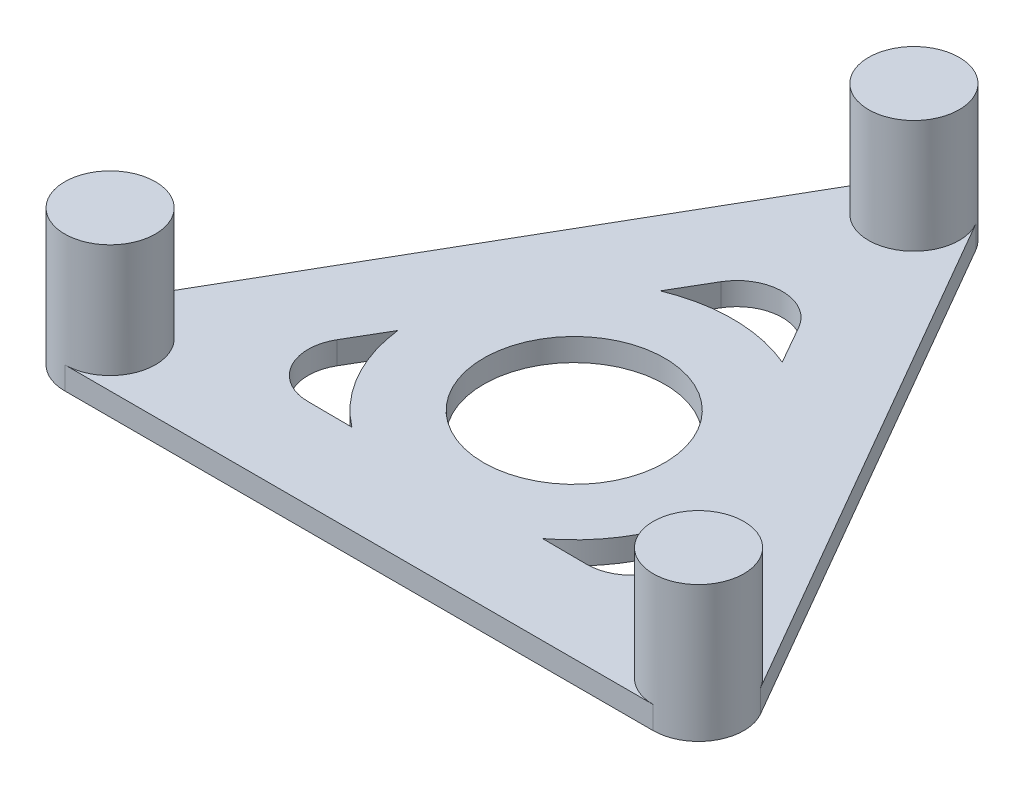
ISO-10303-21;
HEADER;
FILE_DESCRIPTION(('STEP AP214'),'2;1');
FILE_NAME('part.step','',(''),(''),'','','');
FILE_SCHEMA(('AUTOMOTIVE_DESIGN { 1 0 10303 214 1 1 1 1 }'));
ENDSEC;
DATA;
#1=APPLICATION_CONTEXT('core data for automotive mechanical design processes');
#2=APPLICATION_PROTOCOL_DEFINITION('international standard','automotive_design',2000,#1);
#3=PRODUCT_CONTEXT('',#1,'mechanical');
#4=PRODUCT('Part','Part','',(#3));
#5=PRODUCT_RELATED_PRODUCT_CATEGORY('part','',(#4));
#6=PRODUCT_DEFINITION_FORMATION('','',#4);
#7=PRODUCT_DEFINITION_CONTEXT('part definition',#1,'design');
#8=PRODUCT_DEFINITION('design','',#6,#7);
#9=PRODUCT_DEFINITION_SHAPE('','',#8);
#10=(LENGTH_UNIT() NAMED_UNIT(*) SI_UNIT(.MILLI.,.METRE.));
#11=(NAMED_UNIT(*) PLANE_ANGLE_UNIT() SI_UNIT($,.RADIAN.));
#12=(NAMED_UNIT(*) SI_UNIT($,.STERADIAN.) SOLID_ANGLE_UNIT());
#13=UNCERTAINTY_MEASURE_WITH_UNIT(LENGTH_MEASURE(1.E-05),#10,'distance_accuracy_value','');
#14=(GEOMETRIC_REPRESENTATION_CONTEXT(3) GLOBAL_UNCERTAINTY_ASSIGNED_CONTEXT((#13)) GLOBAL_UNIT_ASSIGNED_CONTEXT((#10,
#11,#12)) REPRESENTATION_CONTEXT('',''));
#15=CARTESIAN_POINT('',(0.,0.,0.));
#16=DIRECTION('',(0.,0.,1.));
#17=DIRECTION('',(1.,0.,0.));
#18=AXIS2_PLACEMENT_3D('',#15,#16,#17);
#19=CARTESIAN_POINT('',(-0.0324301599771953,1.,5.57369827589724));
#20=DIRECTION('',(-0.00581832913066579,0.,0.999983073379808));
#21=DIRECTION('',(0.999983073379808,0.,0.00581832913066579));
#22=AXIS2_PLACEMENT_3D('',#19,#20,#21);
#23=PLANE('',#22);
#24=DIRECTION('',(-0.999983073379808,0.,-0.00581832913066579));
#25=VECTOR('',#24,1.);
#26=CARTESIAN_POINT('',(-0.0324301599771953,0.,5.57369827589724));
#27=LINE('',#26,#25);
#28=CARTESIAN_POINT('',(6.15745546033046,0.,5.60971367733638));
#29=VERTEX_POINT('',#28);
#30=CARTESIAN_POINT('',(4.20221607489537,0.,5.59833725849836));
#31=VERTEX_POINT('',#30);
#32=EDGE_CURVE('E253',#29,#31,#27,.T.);
#33=ORIENTED_EDGE('',*,*,#32,.T.);
#34=DIRECTION('',(0.,-1.,0.));
#35=VECTOR('',#34,1.);
#36=CARTESIAN_POINT('',(4.20221607489537,1.,5.59833725849836));
#37=LINE('',#36,#35);
#38=CARTESIAN_POINT('',(4.20221607489537,1.,5.59833725849836));
#39=VERTEX_POINT('',#38);
#40=EDGE_CURVE('E11',#39,#31,#37,.T.);
#41=ORIENTED_EDGE('',*,*,#40,.F.);
#42=DIRECTION('',(-0.999983073379808,0.,-0.00581832913066579));
#43=VECTOR('',#42,1.);
#44=CARTESIAN_POINT('',(-0.0324301599771953,1.,5.57369827589724));
#45=LINE('',#44,#43);
#46=CARTESIAN_POINT('',(6.15745546033046,1.,5.60971367733638));
#47=VERTEX_POINT('',#46);
#48=EDGE_CURVE('E183',#47,#39,#45,.T.);
#49=ORIENTED_EDGE('',*,*,#48,.F.);
#50=DIRECTION('',(0.,-1.,0.));
#51=VECTOR('',#50,1.);
#52=CARTESIAN_POINT('',(6.15745546033046,1.,5.60971367733638));
#53=LINE('',#52,#51);
#54=EDGE_CURVE('E69',#47,#29,#53,.T.);
#55=ORIENTED_EDGE('',*,*,#54,.T.);
#56=EDGE_LOOP('',(#33,#41,#49,#55));
#57=FACE_BOUND('',#56,.T.);
#58=ADVANCED_FACE('F47',(#57),#23,.F.);
#59=CARTESIAN_POINT('',(0.,1.,0.));
#60=DIRECTION('',(0.,-1.,0.));
#61=DIRECTION('',(0.,0.,-1.));
#62=AXIS2_PLACEMENT_3D('',#59,#60,#61);
#63=CYLINDRICAL_SURFACE('',#62,7.);
#64=CARTESIAN_POINT('',(0.,0.,0.));
#65=DIRECTION('',(0.,1.,0.));
#66=DIRECTION('',(0.,0.,1.));
#67=AXIS2_PLACEMENT_3D('',#64,#65,#66);
#68=CIRCLE('',#67,7.);
#69=CARTESIAN_POINT('',(6.93916451252544,0.,0.920866911180755));
#70=VERTEX_POINT('',#69);
#71=EDGE_CURVE('E195',#31,#70,#68,.T.);
#72=ORIENTED_EDGE('',*,*,#71,.T.);
#73=DIRECTION('',(0.,-1.,0.));
#74=VECTOR('',#73,1.);
#75=CARTESIAN_POINT('',(6.93916451252544,1.,0.920866911180755));
#76=LINE('',#75,#74);
#77=CARTESIAN_POINT('',(6.93916451252544,1.,0.920866911180755));
#78=VERTEX_POINT('',#77);
#79=EDGE_CURVE('E58',#78,#70,#76,.T.);
#80=ORIENTED_EDGE('',*,*,#79,.F.);
#81=CARTESIAN_POINT('',(0.,1.,0.));
#82=DIRECTION('',(0.,1.,0.));
#83=DIRECTION('',(0.,0.,1.));
#84=AXIS2_PLACEMENT_3D('',#81,#82,#83);
#85=CIRCLE('',#84,7.);
#86=EDGE_CURVE('E179',#39,#78,#85,.T.);
#87=ORIENTED_EDGE('',*,*,#86,.F.);
#88=ORIENTED_EDGE('',*,*,#40,.T.);
#89=EDGE_LOOP('',(#72,#80,#87,#88));
#90=FACE_BOUND('',#89,.T.);
#91=ADVANCED_FACE('F192',(#90),#63,.T.);
#92=CARTESIAN_POINT('',(4.84317937994514,1.,-2.75876379555957));
#93=DIRECTION('',(0.868919909466686,0.,-0.494952715855168));
#94=DIRECTION('',(-0.494952715855168,0.,-0.868919909466686));
#95=AXIS2_PLACEMENT_3D('',#92,#93,#94);
#96=PLANE('',#95);
#97=DIRECTION('',(0.494952715855168,0.,0.868919909466686));
#98=VECTOR('',#97,1.);
#99=CARTESIAN_POINT('',(4.84317937994514,0.,-2.75876379555957));
#100=LINE('',#99,#98);
#101=CARTESIAN_POINT('',(7.90693193752517,0.,2.61984209886643));
#102=VERTEX_POINT('',#101);
#103=EDGE_CURVE('E258',#70,#102,#100,.T.);
#104=ORIENTED_EDGE('',*,*,#103,.T.);
#105=DIRECTION('',(0.,-1.,0.));
#106=VECTOR('',#105,1.);
#107=CARTESIAN_POINT('',(7.90693193752517,1.,2.61984209886643));
#108=LINE('',#107,#106);
#109=CARTESIAN_POINT('',(7.90693193752517,1.,2.61984209886643));
#110=VERTEX_POINT('',#109);
#111=EDGE_CURVE('E130',#110,#102,#108,.T.);
#112=ORIENTED_EDGE('',*,*,#111,.F.);
#113=DIRECTION('',(0.494952715855168,0.,0.868919909466686));
#114=VECTOR('',#113,1.);
#115=CARTESIAN_POINT('',(4.84317937994514,1.,-2.75876379555957));
#116=LINE('',#115,#114);
#117=EDGE_CURVE('E184',#78,#110,#116,.T.);
#118=ORIENTED_EDGE('',*,*,#117,.F.);
#119=ORIENTED_EDGE('',*,*,#79,.T.);
#120=EDGE_LOOP('',(#104,#112,#118,#119));
#121=FACE_BOUND('',#120,.T.);
#122=ADVANCED_FACE('F197',(#121),#96,.F.);
#123=CARTESIAN_POINT('',(-4.81074921996793,1.,-2.81493448033765));
#124=DIRECTION('',(-0.86310158033602,0.,-0.505030357524639));
#125=DIRECTION('',(-0.505030357524639,0.,0.86310158033602));
#126=AXIS2_PLACEMENT_3D('',#123,#124,#125);
#127=PLANE('',#126);
#128=DIRECTION('',(0.505030357524639,0.,-0.86310158033602));
#129=VECTOR('',#128,1.);
#130=CARTESIAN_POINT('',(-4.81074921996793,0.,-2.81493448033765));
#131=LINE('',#130,#129);
#132=CARTESIAN_POINT('',(-7.93688228269554,0.,2.52765601264919));
#133=VERTEX_POINT('',#132);
#134=CARTESIAN_POINT('',(-6.94941032226019,0.,0.840057243801566));
#135=VERTEX_POINT('',#134);
#136=EDGE_CURVE('E236',#133,#135,#131,.T.);
#137=ORIENTED_EDGE('',*,*,#136,.T.);
#138=DIRECTION('',(0.,-1.,0.));
#139=VECTOR('',#138,1.);
#140=CARTESIAN_POINT('',(-6.94941032226019,1.,0.840057243801566));
#141=LINE('',#140,#139);
#142=CARTESIAN_POINT('',(-6.94941032226019,1.,0.840057243801566));
#143=VERTEX_POINT('',#142);
#144=EDGE_CURVE('E266',#143,#135,#141,.T.);
#145=ORIENTED_EDGE('',*,*,#144,.F.);
#146=DIRECTION('',(0.505030357524639,0.,-0.86310158033602));
#147=VECTOR('',#146,1.);
#148=CARTESIAN_POINT('',(-4.81074921996793,1.,-2.81493448033765));
#149=LINE('',#148,#147);
#150=CARTESIAN_POINT('',(-7.93688228269554,1.,2.52765601264919));
#151=VERTEX_POINT('',#150);
#152=EDGE_CURVE('E386',#151,#143,#149,.T.);
#153=ORIENTED_EDGE('',*,*,#152,.F.);
#154=DIRECTION('',(0.,-1.,0.));
#155=VECTOR('',#154,1.);
#156=CARTESIAN_POINT('',(-7.93688228269554,1.,2.52765601264919));
#157=LINE('',#156,#155);
#158=EDGE_CURVE('E267',#151,#133,#157,.T.);
#159=ORIENTED_EDGE('',*,*,#158,.T.);
#160=EDGE_LOOP('',(#137,#145,#153,#159));
#161=FACE_BOUND('',#160,.T.);
#162=ADVANCED_FACE('F414',(#161),#127,.F.);
#163=CARTESIAN_POINT('',(0.,1.,0.));
#164=DIRECTION('',(0.,-1.,0.));
#165=DIRECTION('',(0.,0.,-1.));
#166=AXIS2_PLACEMENT_3D('',#163,#164,#165);
#167=CYLINDRICAL_SURFACE('',#166,7.);
#168=CARTESIAN_POINT('',(0.,0.,0.));
#169=DIRECTION('',(0.,1.,0.));
#170=DIRECTION('',(0.,0.,1.));
#171=AXIS2_PLACEMENT_3D('',#168,#169,#170);
#172=CIRCLE('',#171,7.);
#173=CARTESIAN_POINT('',(-4.26707639484977,0.,5.54905929329611));
#174=VERTEX_POINT('',#173);
#175=EDGE_CURVE('E241',#135,#174,#172,.T.);
#176=ORIENTED_EDGE('',*,*,#175,.T.);
#177=DIRECTION('',(0.,-1.,0.));
#178=VECTOR('',#177,1.);
#179=CARTESIAN_POINT('',(-4.26707639484977,1.,5.54905929329611));
#180=LINE('',#179,#178);
#181=CARTESIAN_POINT('',(-4.26707639484977,1.,5.54905929329611));
#182=VERTEX_POINT('',#181);
#183=EDGE_CURVE('E279',#182,#174,#180,.T.);
#184=ORIENTED_EDGE('',*,*,#183,.F.);
#185=CARTESIAN_POINT('',(0.,1.,0.));
#186=DIRECTION('',(0.,1.,0.));
#187=DIRECTION('',(0.,0.,1.));
#188=AXIS2_PLACEMENT_3D('',#185,#186,#187);
#189=CIRCLE('',#188,7.);
#190=EDGE_CURVE('E395',#143,#182,#189,.T.);
#191=ORIENTED_EDGE('',*,*,#190,.F.);
#192=ORIENTED_EDGE('',*,*,#144,.T.);
#193=EDGE_LOOP('',(#176,#184,#191,#192));
#194=FACE_BOUND('',#193,.T.);
#195=ADVANCED_FACE('F418',(#194),#167,.T.);
#196=CARTESIAN_POINT('',(-0.0324301599771957,1.,5.57369827589723));
#197=DIRECTION('',(-0.00581832913066586,0.,0.999983073379808));
#198=DIRECTION('',(0.999983073379808,0.,0.00581832913066586));
#199=AXIS2_PLACEMENT_3D('',#196,#197,#198);
#200=PLANE('',#199);
#201=DIRECTION('',(-0.999983073379808,0.,-0.00581832913066586));
#202=VECTOR('',#201,1.);
#203=CARTESIAN_POINT('',(-0.0324301599771957,0.,5.57369827589723));
#204=LINE('',#203,#202);
#205=CARTESIAN_POINT('',(-6.22231578028483,0.,5.53768287445809));
#206=VERTEX_POINT('',#205);
#207=EDGE_CURVE('E242',#174,#206,#204,.T.);
#208=ORIENTED_EDGE('',*,*,#207,.T.);
#209=DIRECTION('',(0.,-1.,0.));
#210=VECTOR('',#209,1.);
#211=CARTESIAN_POINT('',(-6.22231578028483,1.,5.53768287445809));
#212=LINE('',#211,#210);
#213=CARTESIAN_POINT('',(-6.22231578028483,1.,5.53768287445809));
#214=VERTEX_POINT('',#213);
#215=EDGE_CURVE('E272',#214,#206,#212,.T.);
#216=ORIENTED_EDGE('',*,*,#215,.F.);
#217=DIRECTION('',(-0.999983073379808,0.,-0.00581832913066586));
#218=VECTOR('',#217,1.);
#219=CARTESIAN_POINT('',(-0.0324301599771957,1.,5.57369827589723));
#220=LINE('',#219,#218);
#221=EDGE_CURVE('E397',#182,#214,#220,.T.);
#222=ORIENTED_EDGE('',*,*,#221,.F.);
#223=ORIENTED_EDGE('',*,*,#183,.T.);
#224=EDGE_LOOP('',(#208,#216,#222,#223));
#225=FACE_BOUND('',#224,.T.);
#226=ADVANCED_FACE('F419',(#225),#200,.F.);
#227=CARTESIAN_POINT('',(4.84317937994513,1.,-2.75876379555958));
#228=DIRECTION('',(0.868919909466685,0.,-0.494952715855169));
#229=DIRECTION('',(-0.494952715855169,0.,-0.868919909466685));
#230=AXIS2_PLACEMENT_3D('',#227,#228,#229);
#231=PLANE('',#230);
#232=DIRECTION('',(0.494952715855169,0.,0.868919909466685));
#233=VECTOR('',#232,1.);
#234=CARTESIAN_POINT('',(4.84317937994513,0.,-2.75876379555958));
#235=LINE('',#234,#233);
#236=CARTESIAN_POINT('',(1.77942682236511,0.,-8.13736968998556));
#237=VERTEX_POINT('',#236);
#238=CARTESIAN_POINT('',(2.74719424736483,0.,-6.4383945022999));
#239=VERTEX_POINT('',#238);
#240=EDGE_CURVE('E224',#237,#239,#235,.T.);
#241=ORIENTED_EDGE('',*,*,#240,.T.);
#242=DIRECTION('',(0.,-1.,0.));
#243=VECTOR('',#242,1.);
#244=CARTESIAN_POINT('',(2.74719424736483,1.,-6.4383945022999));
#245=LINE('',#244,#243);
#246=CARTESIAN_POINT('',(2.74719424736483,1.,-6.4383945022999));
#247=VERTEX_POINT('',#246);
#248=EDGE_CURVE('E273',#247,#239,#245,.T.);
#249=ORIENTED_EDGE('',*,*,#248,.F.);
#250=DIRECTION('',(0.494952715855169,0.,0.868919909466685));
#251=VECTOR('',#250,1.);
#252=CARTESIAN_POINT('',(4.84317937994513,1.,-2.75876379555958));
#253=LINE('',#252,#251);
#254=CARTESIAN_POINT('',(1.77942682236511,1.,-8.13736968998556));
#255=VERTEX_POINT('',#254);
#256=EDGE_CURVE('E374',#255,#247,#253,.T.);
#257=ORIENTED_EDGE('',*,*,#256,.F.);
#258=DIRECTION('',(0.,-1.,0.));
#259=VECTOR('',#258,1.);
#260=CARTESIAN_POINT('',(1.77942682236511,1.,-8.13736968998556));
#261=LINE('',#260,#259);
#262=EDGE_CURVE('E282',#255,#237,#261,.T.);
#263=ORIENTED_EDGE('',*,*,#262,.T.);
#264=EDGE_LOOP('',(#241,#249,#257,#263));
#265=FACE_BOUND('',#264,.T.);
#266=ADVANCED_FACE('F453',(#265),#231,.F.);
#267=CARTESIAN_POINT('',(0.,1.,0.));
#268=DIRECTION('',(0.,-1.,0.));
#269=DIRECTION('',(0.,0.,-1.));
#270=AXIS2_PLACEMENT_3D('',#267,#268,#269);
#271=CYLINDRICAL_SURFACE('',#270,7.);
#272=CARTESIAN_POINT('',(0.,0.,0.));
#273=DIRECTION('',(0.,1.,0.));
#274=DIRECTION('',(0.,0.,1.));
#275=AXIS2_PLACEMENT_3D('',#272,#273,#274);
#276=CIRCLE('',#275,7.);
#277=CARTESIAN_POINT('',(-2.67208811767565,0.,-6.46992620447688));
#278=VERTEX_POINT('',#277);
#279=EDGE_CURVE('E226',#239,#278,#276,.T.);
#280=ORIENTED_EDGE('',*,*,#279,.T.);
#281=DIRECTION('',(0.,-1.,0.));
#282=VECTOR('',#281,1.);
#283=CARTESIAN_POINT('',(-2.67208811767565,1.,-6.46992620447688));
#284=LINE('',#283,#282);
#285=CARTESIAN_POINT('',(-2.67208811767565,1.,-6.46992620447688));
#286=VERTEX_POINT('',#285);
#287=EDGE_CURVE('E292',#286,#278,#284,.T.);
#288=ORIENTED_EDGE('',*,*,#287,.F.);
#289=CARTESIAN_POINT('',(0.,1.,0.));
#290=DIRECTION('',(0.,1.,0.));
#291=DIRECTION('',(0.,0.,1.));
#292=AXIS2_PLACEMENT_3D('',#289,#290,#291);
#293=CIRCLE('',#292,7.);
#294=EDGE_CURVE('E377',#247,#286,#293,.T.);
#295=ORIENTED_EDGE('',*,*,#294,.F.);
#296=ORIENTED_EDGE('',*,*,#248,.T.);
#297=EDGE_LOOP('',(#280,#288,#295,#296));
#298=FACE_BOUND('',#297,.T.);
#299=ADVANCED_FACE('F463',(#298),#271,.T.);
#300=CARTESIAN_POINT('',(-4.81074921996792,1.,-2.81493448033765));
#301=DIRECTION('',(-0.86310158033602,0.,-0.505030357524639));
#302=DIRECTION('',(-0.505030357524639,0.,0.86310158033602));
#303=AXIS2_PLACEMENT_3D('',#300,#301,#302);
#304=PLANE('',#303);
#305=DIRECTION('',(0.505030357524639,0.,-0.86310158033602));
#306=VECTOR('',#305,1.);
#307=CARTESIAN_POINT('',(-4.81074921996792,0.,-2.81493448033765));
#308=LINE('',#307,#306);
#309=CARTESIAN_POINT('',(-1.6846161572403,0.,-8.1575249733245));
#310=VERTEX_POINT('',#309);
#311=EDGE_CURVE('E227',#278,#310,#308,.T.);
#312=ORIENTED_EDGE('',*,*,#311,.T.);
#313=DIRECTION('',(0.,-1.,0.));
#314=VECTOR('',#313,1.);
#315=CARTESIAN_POINT('',(-1.6846161572403,1.,-8.1575249733245));
#316=LINE('',#315,#314);
#317=CARTESIAN_POINT('',(-1.6846161572403,1.,-8.1575249733245));
#318=VERTEX_POINT('',#317);
#319=EDGE_CURVE('E288',#318,#310,#316,.T.);
#320=ORIENTED_EDGE('',*,*,#319,.F.);
#321=DIRECTION('',(0.505030357524639,0.,-0.86310158033602));
#322=VECTOR('',#321,1.);
#323=CARTESIAN_POINT('',(-4.81074921996792,1.,-2.81493448033765));
#324=LINE('',#323,#322);
#325=EDGE_CURVE('E385',#286,#318,#324,.T.);
#326=ORIENTED_EDGE('',*,*,#325,.F.);
#327=ORIENTED_EDGE('',*,*,#287,.T.);
#328=EDGE_LOOP('',(#312,#320,#326,#327));
#329=FACE_BOUND('',#328,.T.);
#330=ADVANCED_FACE('F464',(#329),#304,.F.);
#331=CARTESIAN_POINT('',(0.,1.,9.50166274150167));
#332=DIRECTION('',(0.,0.,1.));
#333=DIRECTION('',(1.,0.,0.));
#334=AXIS2_PLACEMENT_3D('',#331,#332,#333);
#335=PLANE('',#334);
#336=DIRECTION('',(-1.,0.,0.));
#337=VECTOR('',#336,1.);
#338=CARTESIAN_POINT('',(0.,0.,9.50166274150167));
#339=LINE('',#338,#337);
#340=CARTESIAN_POINT('',(12.9903810567666,0.,9.50166274150166));
#341=VERTEX_POINT('',#340);
#342=CARTESIAN_POINT('',(-12.9903810567666,0.,9.50166274150167));
#343=VERTEX_POINT('',#342);
#344=EDGE_CURVE('E209',#341,#343,#339,.T.);
#345=ORIENTED_EDGE('',*,*,#344,.F.);
#346=DIRECTION('',(0.,-1.,0.));
#347=VECTOR('',#346,1.);
#348=CARTESIAN_POINT('',(12.9903810567666,1.,9.50166274150166));
#349=LINE('',#348,#347);
#350=CARTESIAN_POINT('',(12.9903810567666,1.,9.50166274150166));
#351=VERTEX_POINT('',#350);
#352=EDGE_CURVE('E309',#351,#341,#349,.T.);
#353=ORIENTED_EDGE('',*,*,#352,.F.);
#354=DIRECTION('',(-1.,0.,0.));
#355=VECTOR('',#354,1.);
#356=CARTESIAN_POINT('',(0.,1.,9.50166274150167));
#357=LINE('',#356,#355);
#358=CARTESIAN_POINT('',(-12.9903810567666,1.,9.50166274150167));
#359=VERTEX_POINT('',#358);
#360=EDGE_CURVE('E325',#351,#359,#357,.T.);
#361=ORIENTED_EDGE('',*,*,#360,.T.);
#362=DIRECTION('',(0.,-1.,0.));
#363=VECTOR('',#362,1.);
#364=CARTESIAN_POINT('',(-12.9903810567666,1.,9.50166274150167));
#365=LINE('',#364,#363);
#366=EDGE_CURVE('E52',#359,#343,#365,.T.);
#367=ORIENTED_EDGE('',*,*,#366,.T.);
#368=EDGE_LOOP('',(#345,#353,#361,#367));
#369=FACE_BOUND('',#368,.T.);
#370=ADVANCED_FACE('F321',(#369),#335,.T.);
#371=CARTESIAN_POINT('',(8.22868131233254,1.,-4.75083137075084));
#372=DIRECTION('',(0.866025403784439,0.,-0.5));
#373=DIRECTION('',(-0.5,0.,-0.866025403784439));
#374=AXIS2_PLACEMENT_3D('',#371,#372,#373);
#375=PLANE('',#374);
#376=DIRECTION('',(0.5,0.,0.866025403784439));
#377=VECTOR('',#376,1.);
#378=CARTESIAN_POINT('',(8.22868131233254,0.,-4.75083137075084));
#379=LINE('',#378,#377);
#380=CARTESIAN_POINT('',(1.73349078394925,0.,-16.0008313707508));
#381=VERTEX_POINT('',#380);
#382=CARTESIAN_POINT('',(14.7238718407158,0.,6.49916862924916));
#383=VERTEX_POINT('',#382);
#384=EDGE_CURVE('E214',#381,#383,#379,.T.);
#385=ORIENTED_EDGE('',*,*,#384,.F.);
#386=DIRECTION('',(0.,-1.,0.));
#387=VECTOR('',#386,1.);
#388=CARTESIAN_POINT('',(1.73349078394925,1.,-16.0008313707508));
#389=LINE('',#388,#387);
#390=CARTESIAN_POINT('',(1.73349078394928,1.,-16.0008313707508));
#391=VERTEX_POINT('',#390);
#392=EDGE_CURVE('E304',#391,#381,#389,.T.);
#393=ORIENTED_EDGE('',*,*,#392,.F.);
#394=DIRECTION('',(0.5,0.,0.866025403784439));
#395=VECTOR('',#394,1.);
#396=CARTESIAN_POINT('',(8.22868131233254,1.,-4.75083137075084));
#397=LINE('',#396,#395);
#398=CARTESIAN_POINT('',(14.7238718407158,1.,6.49916862924916));
#399=VERTEX_POINT('',#398);
#400=EDGE_CURVE('E361',#391,#399,#397,.T.);
#401=ORIENTED_EDGE('',*,*,#400,.T.);
#402=DIRECTION('',(0.,-1.,0.));
#403=VECTOR('',#402,1.);
#404=CARTESIAN_POINT('',(14.7238718407158,1.,6.49916862924916));
#405=LINE('',#404,#403);
#406=EDGE_CURVE('E306',#399,#383,#405,.T.);
#407=ORIENTED_EDGE('',*,*,#406,.T.);
#408=EDGE_LOOP('',(#385,#393,#401,#407));
#409=FACE_BOUND('',#408,.T.);
#410=ADVANCED_FACE('F447',(#409),#375,.T.);
#411=CARTESIAN_POINT('',(-6.2106791220235,1.,3.53771672769847));
#412=DIRECTION('',(0.,-1.,0.));
#413=DIRECTION('',(0.,0.,-1.));
#414=AXIS2_PLACEMENT_3D('',#411,#412,#413);
#415=CYLINDRICAL_SURFACE('',#414,2.);
#416=CARTESIAN_POINT('',(-6.2106791220235,0.,3.53771672769847));
#417=DIRECTION('',(0.,1.,0.));
#418=DIRECTION('',(0.,0.,1.));
#419=AXIS2_PLACEMENT_3D('',#416,#417,#418);
#420=CIRCLE('',#419,2.);
#421=EDGE_CURVE('E248',#206,#133,#420,.F.);
#422=ORIENTED_EDGE('',*,*,#421,.T.);
#423=ORIENTED_EDGE('',*,*,#158,.F.);
#424=CARTESIAN_POINT('',(-6.2106791220235,1.,3.53771672769847));
#425=DIRECTION('',(0.,1.,0.));
#426=DIRECTION('',(0.,0.,1.));
#427=AXIS2_PLACEMENT_3D('',#424,#425,#426);
#428=CIRCLE('',#427,2.);
#429=EDGE_CURVE('E399',#214,#151,#428,.F.);
#430=ORIENTED_EDGE('',*,*,#429,.F.);
#431=ORIENTED_EDGE('',*,*,#215,.T.);
#432=EDGE_LOOP('',(#422,#423,#430,#431));
#433=FACE_BOUND('',#432,.T.);
#434=ADVANCED_FACE('F407',(#433),#415,.F.);
#435=CARTESIAN_POINT('',(0.0415870034317374,1.,-7.14746425827522));
#436=DIRECTION('',(0.,-1.,0.));
#437=DIRECTION('',(0.,0.,-1.));
#438=AXIS2_PLACEMENT_3D('',#435,#436,#437);
#439=CYLINDRICAL_SURFACE('',#438,2.);
#440=CARTESIAN_POINT('',(0.0415870034317374,0.,-7.14746425827522));
#441=DIRECTION('',(0.,1.,0.));
#442=DIRECTION('',(0.,0.,1.));
#443=AXIS2_PLACEMENT_3D('',#440,#441,#442);
#444=CIRCLE('',#443,2.);
#445=EDGE_CURVE('E234',#237,#310,#444,.T.);
#446=ORIENTED_EDGE('',*,*,#445,.F.);
#447=ORIENTED_EDGE('',*,*,#262,.F.);
#448=CARTESIAN_POINT('',(0.0415870034317374,1.,-7.14746425827522));
#449=DIRECTION('',(0.,1.,0.));
#450=DIRECTION('',(0.,0.,1.));
#451=AXIS2_PLACEMENT_3D('',#448,#449,#450);
#452=CIRCLE('',#451,2.);
#453=EDGE_CURVE('E384',#255,#318,#452,.T.);
#454=ORIENTED_EDGE('',*,*,#453,.T.);
#455=ORIENTED_EDGE('',*,*,#319,.T.);
#456=EDGE_LOOP('',(#446,#447,#454,#455));
#457=FACE_BOUND('',#456,.T.);
#458=ADVANCED_FACE('F448',(#457),#439,.F.);
#459=CARTESIAN_POINT('',(-8.22868131233253,1.,-4.75083137075083));
#460=DIRECTION('',(-0.866025403784439,0.,-0.5));
#461=DIRECTION('',(-0.5,0.,0.866025403784439));
#462=AXIS2_PLACEMENT_3D('',#459,#460,#461);
#463=PLANE('',#462);
#464=DIRECTION('',(0.5,0.,-0.866025403784439));
#465=VECTOR('',#464,1.);
#466=CARTESIAN_POINT('',(-8.22868131233253,0.,-4.75083137075083));
#467=LINE('',#466,#465);
#468=CARTESIAN_POINT('',(-14.7238718407158,0.,6.49916862924917));
#469=VERTEX_POINT('',#468);
#470=CARTESIAN_POINT('',(-1.73349078394924,0.,-16.0008313707508));
#471=VERTEX_POINT('',#470);
#472=EDGE_CURVE('E218',#469,#471,#467,.T.);
#473=ORIENTED_EDGE('',*,*,#472,.F.);
#474=DIRECTION('',(0.,-1.,0.));
#475=VECTOR('',#474,1.);
#476=CARTESIAN_POINT('',(-14.7238718407158,1.,6.49916862924917));
#477=LINE('',#476,#475);
#478=CARTESIAN_POINT('',(-14.7238718407158,1.,6.49916862924917));
#479=VERTEX_POINT('',#478);
#480=EDGE_CURVE('E205',#479,#469,#477,.T.);
#481=ORIENTED_EDGE('',*,*,#480,.F.);
#482=DIRECTION('',(0.5,0.,-0.866025403784439));
#483=VECTOR('',#482,1.);
#484=CARTESIAN_POINT('',(-8.22868131233253,1.,-4.75083137075083));
#485=LINE('',#484,#483);
#486=CARTESIAN_POINT('',(-1.73349078394924,1.,-16.0008313707508));
#487=VERTEX_POINT('',#486);
#488=EDGE_CURVE('E371',#479,#487,#485,.T.);
#489=ORIENTED_EDGE('',*,*,#488,.T.);
#490=DIRECTION('',(0.,-1.,0.));
#491=VECTOR('',#490,1.);
#492=CARTESIAN_POINT('',(-1.73349078394924,1.,-16.0008313707508));
#493=LINE('',#492,#491);
#494=EDGE_CURVE('E302',#487,#471,#493,.T.);
#495=ORIENTED_EDGE('',*,*,#494,.T.);
#496=EDGE_LOOP('',(#473,#481,#489,#495));
#497=FACE_BOUND('',#496,.T.);
#498=ADVANCED_FACE('F440',(#497),#463,.T.);
#499=CARTESIAN_POINT('',(0.,1.,0.));
#500=DIRECTION('',(0.,-1.,0.));
#501=DIRECTION('',(0.,0.,-1.));
#502=AXIS2_PLACEMENT_3D('',#499,#500,#501);
#503=CYLINDRICAL_SURFACE('',#502,4.);
#504=CARTESIAN_POINT('',(0.,1.,0.));
#505=DIRECTION('',(0.,1.,0.));
#506=DIRECTION('',(0.,0.,1.));
#507=AXIS2_PLACEMENT_3D('',#504,#505,#506);
#508=CIRCLE('',#507,4.);
#509=CARTESIAN_POINT('',(0.,1.,4.));
#510=VERTEX_POINT('',#509);
#511=EDGE_CURVE('E263',#510,#510,#508,.T.);
#512=ORIENTED_EDGE('',*,*,#511,.T.);
#513=EDGE_LOOP('',(#512));
#514=FACE_BOUND('',#513,.T.);
#515=CARTESIAN_POINT('',(0.,0.,0.));
#516=DIRECTION('',(0.,1.,0.));
#517=DIRECTION('',(0.,0.,1.));
#518=AXIS2_PLACEMENT_3D('',#515,#516,#517);
#519=CIRCLE('',#518,4.);
#520=CARTESIAN_POINT('',(0.,0.,4.));
#521=VERTEX_POINT('',#520);
#522=EDGE_CURVE('E206',#521,#521,#519,.T.);
#523=ORIENTED_EDGE('',*,*,#522,.F.);
#524=EDGE_LOOP('',(#523));
#525=FACE_BOUND('',#524,.T.);
#526=ADVANCED_FACE('F51',(#514,#525),#503,.F.);
#527=CARTESIAN_POINT('',(6.16909211859179,1.,3.60974753057677));
#528=DIRECTION('',(0.,-1.,0.));
#529=DIRECTION('',(0.,0.,-1.));
#530=AXIS2_PLACEMENT_3D('',#527,#528,#529);
#531=CYLINDRICAL_SURFACE('',#530,2.);
#532=CARTESIAN_POINT('',(6.16909211859179,0.,3.60974753057677));
#533=DIRECTION('',(0.,1.,0.));
#534=DIRECTION('',(0.,0.,1.));
#535=AXIS2_PLACEMENT_3D('',#532,#533,#534);
#536=CIRCLE('',#535,2.);
#537=EDGE_CURVE('E259',#29,#102,#536,.T.);
#538=ORIENTED_EDGE('',*,*,#537,.F.);
#539=ORIENTED_EDGE('',*,*,#54,.F.);
#540=CARTESIAN_POINT('',(6.16909211859179,1.,3.60974753057677));
#541=DIRECTION('',(0.,1.,0.));
#542=DIRECTION('',(0.,0.,1.));
#543=AXIS2_PLACEMENT_3D('',#540,#541,#542);
#544=CIRCLE('',#543,2.);
#545=EDGE_CURVE('E200',#47,#110,#544,.T.);
#546=ORIENTED_EDGE('',*,*,#545,.T.);
#547=ORIENTED_EDGE('',*,*,#111,.T.);
#548=EDGE_LOOP('',(#538,#539,#546,#547));
#549=FACE_BOUND('',#548,.T.);
#550=ADVANCED_FACE('F430',(#549),#531,.F.);
#551=CARTESIAN_POINT('',(0.,1.,0.));
#552=DIRECTION('',(0.,1.,0.));
#553=DIRECTION('',(0.,0.,1.));
#554=AXIS2_PLACEMENT_3D('',#551,#552,#553);
#555=PLANE('',#554);
#556=ORIENTED_EDGE('',*,*,#511,.F.);
#557=EDGE_LOOP('',(#556));
#558=FACE_BOUND('',#557,.T.);
#559=CARTESIAN_POINT('',(-12.9903810567666,1.,7.50000000000001));
#560=DIRECTION('',(0.,1.,0.));
#561=DIRECTION('',(0.,0.,1.));
#562=AXIS2_PLACEMENT_3D('',#559,#560,#561);
#563=CIRCLE('',#562,2.00166274150165);
#564=EDGE_CURVE('E136',#359,#479,#563,.T.);
#565=ORIENTED_EDGE('',*,*,#564,.F.);
#566=ORIENTED_EDGE('',*,*,#360,.F.);
#567=CARTESIAN_POINT('',(12.9903810567666,1.,7.49999999999999));
#568=DIRECTION('',(0.,1.,0.));
#569=DIRECTION('',(0.,0.,1.));
#570=AXIS2_PLACEMENT_3D('',#567,#568,#569);
#571=CIRCLE('',#570,2.00166274150165);
#572=EDGE_CURVE('E356',#399,#351,#571,.T.);
#573=ORIENTED_EDGE('',*,*,#572,.F.);
#574=ORIENTED_EDGE('',*,*,#400,.F.);
#575=CARTESIAN_POINT('',(0.,1.,-15.));
#576=DIRECTION('',(0.,1.,0.));
#577=DIRECTION('',(0.,0.,1.));
#578=AXIS2_PLACEMENT_3D('',#575,#576,#577);
#579=CIRCLE('',#578,2.00166274150165);
#580=EDGE_CURVE('E370',#487,#391,#579,.T.);
#581=ORIENTED_EDGE('',*,*,#580,.F.);
#582=ORIENTED_EDGE('',*,*,#488,.F.);
#583=EDGE_LOOP('',(#565,#566,#573,#574,#581,#582));
#584=FACE_BOUND('',#583,.T.);
#585=ORIENTED_EDGE('',*,*,#256,.T.);
#586=ORIENTED_EDGE('',*,*,#294,.T.);
#587=ORIENTED_EDGE('',*,*,#325,.T.);
#588=ORIENTED_EDGE('',*,*,#453,.F.);
#589=EDGE_LOOP('',(#585,#586,#587,#588));
#590=FACE_BOUND('',#589,.T.);
#591=ORIENTED_EDGE('',*,*,#152,.T.);
#592=ORIENTED_EDGE('',*,*,#190,.T.);
#593=ORIENTED_EDGE('',*,*,#221,.T.);
#594=ORIENTED_EDGE('',*,*,#429,.T.);
#595=EDGE_LOOP('',(#591,#592,#593,#594));
#596=FACE_BOUND('',#595,.T.);
#597=ORIENTED_EDGE('',*,*,#48,.T.);
#598=ORIENTED_EDGE('',*,*,#86,.T.);
#599=ORIENTED_EDGE('',*,*,#117,.T.);
#600=ORIENTED_EDGE('',*,*,#545,.F.);
#601=EDGE_LOOP('',(#597,#598,#599,#600));
#602=FACE_BOUND('',#601,.T.);
#603=ADVANCED_FACE('F182',(#558,#584,#590,#596,#602),#555,.T.);
#604=CARTESIAN_POINT('',(0.,0.,0.));
#605=DIRECTION('',(0.,1.,0.));
#606=DIRECTION('',(0.,0.,1.));
#607=AXIS2_PLACEMENT_3D('',#604,#605,#606);
#608=PLANE('',#607);
#609=ORIENTED_EDGE('',*,*,#522,.T.);
#610=EDGE_LOOP('',(#609));
#611=FACE_BOUND('',#610,.T.);
#612=ORIENTED_EDGE('',*,*,#344,.T.);
#613=CARTESIAN_POINT('',(-12.9903810567667,0.,7.50000000000005));
#614=DIRECTION('',(0.,-1.,0.));
#615=DIRECTION('',(0.,0.,-1.));
#616=AXIS2_PLACEMENT_3D('',#613,#614,#615);
#617=CIRCLE('',#616,2.00166274150162);
#618=EDGE_CURVE('E328',#343,#469,#617,.T.);
#619=ORIENTED_EDGE('',*,*,#618,.T.);
#620=ORIENTED_EDGE('',*,*,#472,.T.);
#621=CARTESIAN_POINT('',(0.,0.,-14.9999999999999));
#622=DIRECTION('',(0.,-1.,0.));
#623=DIRECTION('',(0.,0.,-1.));
#624=AXIS2_PLACEMENT_3D('',#621,#622,#623);
#625=CIRCLE('',#624,2.0016627415017);
#626=EDGE_CURVE('E341',#471,#381,#625,.T.);
#627=ORIENTED_EDGE('',*,*,#626,.T.);
#628=ORIENTED_EDGE('',*,*,#384,.T.);
#629=CARTESIAN_POINT('',(12.9903810567666,0.,7.49999999999998));
#630=DIRECTION('',(0.,-1.,0.));
#631=DIRECTION('',(0.,0.,-1.));
#632=AXIS2_PLACEMENT_3D('',#629,#630,#631);
#633=CIRCLE('',#632,2.00166274150168);
#634=EDGE_CURVE('E329',#383,#341,#633,.T.);
#635=ORIENTED_EDGE('',*,*,#634,.T.);
#636=EDGE_LOOP('',(#612,#619,#620,#627,#628,#635));
#637=FACE_BOUND('',#636,.T.);
#638=ORIENTED_EDGE('',*,*,#240,.F.);
#639=ORIENTED_EDGE('',*,*,#445,.T.);
#640=ORIENTED_EDGE('',*,*,#311,.F.);
#641=ORIENTED_EDGE('',*,*,#279,.F.);
#642=EDGE_LOOP('',(#638,#639,#640,#641));
#643=FACE_BOUND('',#642,.T.);
#644=ORIENTED_EDGE('',*,*,#136,.F.);
#645=ORIENTED_EDGE('',*,*,#421,.F.);
#646=ORIENTED_EDGE('',*,*,#207,.F.);
#647=ORIENTED_EDGE('',*,*,#175,.F.);
#648=EDGE_LOOP('',(#644,#645,#646,#647));
#649=FACE_BOUND('',#648,.T.);
#650=ORIENTED_EDGE('',*,*,#32,.F.);
#651=ORIENTED_EDGE('',*,*,#537,.T.);
#652=ORIENTED_EDGE('',*,*,#103,.F.);
#653=ORIENTED_EDGE('',*,*,#71,.F.);
#654=EDGE_LOOP('',(#650,#651,#652,#653));
#655=FACE_BOUND('',#654,.T.);
#656=ADVANCED_FACE('F330',(#611,#637,#643,#649,#655),#608,.F.);
#657=CARTESIAN_POINT('',(0.,6.,-14.9999999999999));
#658=DIRECTION('',(0.,-1.,0.));
#659=DIRECTION('',(0.,0.,-1.));
#660=AXIS2_PLACEMENT_3D('',#657,#658,#659);
#661=CYLINDRICAL_SURFACE('',#660,2.0016627415017);
#662=CARTESIAN_POINT('',(0.,6.,-14.9999999999999));
#663=DIRECTION('',(0.,-1.,0.));
#664=DIRECTION('',(0.,0.,-1.));
#665=AXIS2_PLACEMENT_3D('',#662,#663,#664);
#666=CIRCLE('',#665,2.0016627415017);
#667=CARTESIAN_POINT('',(0.,6.,-17.0016627415016));
#668=VERTEX_POINT('',#667);
#669=EDGE_CURVE('E349',#668,#668,#666,.T.);
#670=ORIENTED_EDGE('',*,*,#669,.T.);
#671=EDGE_LOOP('',(#670));
#672=FACE_BOUND('',#671,.T.);
#673=ORIENTED_EDGE('',*,*,#494,.F.);
#674=ORIENTED_EDGE('',*,*,#580,.T.);
#675=ORIENTED_EDGE('',*,*,#392,.T.);
#676=ORIENTED_EDGE('',*,*,#626,.F.);
#677=EDGE_LOOP('',(#673,#674,#675,#676));
#678=FACE_BOUND('',#677,.T.);
#679=ADVANCED_FACE('F424',(#672,#678),#661,.T.);
#680=CARTESIAN_POINT('',(0.,6.,-14.9999999999999));
#681=DIRECTION('',(0.,-1.,0.));
#682=DIRECTION('',(0.,0.,-1.));
#683=AXIS2_PLACEMENT_3D('',#680,#681,#682);
#684=PLANE('',#683);
#685=ORIENTED_EDGE('',*,*,#669,.F.);
#686=EDGE_LOOP('',(#685));
#687=FACE_BOUND('',#686,.T.);
#688=ADVANCED_FACE('F512',(#687),#684,.F.);
#689=CARTESIAN_POINT('',(12.9903810567666,6.,7.49999999999998));
#690=DIRECTION('',(0.,-1.,0.));
#691=DIRECTION('',(0.,0.,-1.));
#692=AXIS2_PLACEMENT_3D('',#689,#690,#691);
#693=CYLINDRICAL_SURFACE('',#692,2.00166274150168);
#694=CARTESIAN_POINT('',(12.9903810567666,6.,7.49999999999998));
#695=DIRECTION('',(0.,-1.,0.));
#696=DIRECTION('',(0.,0.,-1.));
#697=AXIS2_PLACEMENT_3D('',#694,#695,#696);
#698=CIRCLE('',#697,2.00166274150168);
#699=CARTESIAN_POINT('',(12.9903810567666,6.,5.4983372584983));
#700=VERTEX_POINT('',#699);
#701=EDGE_CURVE('E338',#700,#700,#698,.T.);
#702=ORIENTED_EDGE('',*,*,#701,.T.);
#703=EDGE_LOOP('',(#702));
#704=FACE_BOUND('',#703,.T.);
#705=ORIENTED_EDGE('',*,*,#406,.F.);
#706=ORIENTED_EDGE('',*,*,#572,.T.);
#707=ORIENTED_EDGE('',*,*,#352,.T.);
#708=ORIENTED_EDGE('',*,*,#634,.F.);
#709=EDGE_LOOP('',(#705,#706,#707,#708));
#710=FACE_BOUND('',#709,.T.);
#711=ADVANCED_FACE('F517',(#704,#710),#693,.T.);
#712=CARTESIAN_POINT('',(12.9903810567666,6.,7.49999999999998));
#713=DIRECTION('',(0.,-1.,0.));
#714=DIRECTION('',(0.,0.,-1.));
#715=AXIS2_PLACEMENT_3D('',#712,#713,#714);
#716=PLANE('',#715);
#717=ORIENTED_EDGE('',*,*,#701,.F.);
#718=EDGE_LOOP('',(#717));
#719=FACE_BOUND('',#718,.T.);
#720=ADVANCED_FACE('F530',(#719),#716,.F.);
#721=CARTESIAN_POINT('',(-12.9903810567667,6.,7.50000000000005));
#722=DIRECTION('',(0.,-1.,0.));
#723=DIRECTION('',(0.,0.,-1.));
#724=AXIS2_PLACEMENT_3D('',#721,#722,#723);
#725=CYLINDRICAL_SURFACE('',#724,2.00166274150162);
#726=CARTESIAN_POINT('',(-12.9903810567667,6.,7.50000000000005));
#727=DIRECTION('',(0.,-1.,0.));
#728=DIRECTION('',(0.,0.,-1.));
#729=AXIS2_PLACEMENT_3D('',#726,#727,#728);
#730=CIRCLE('',#729,2.00166274150162);
#731=CARTESIAN_POINT('',(-12.9903810567667,6.,5.49833725849843));
#732=VERTEX_POINT('',#731);
#733=EDGE_CURVE('E211',#732,#732,#730,.T.);
#734=ORIENTED_EDGE('',*,*,#733,.T.);
#735=EDGE_LOOP('',(#734));
#736=FACE_BOUND('',#735,.T.);
#737=ORIENTED_EDGE('',*,*,#366,.F.);
#738=ORIENTED_EDGE('',*,*,#564,.T.);
#739=ORIENTED_EDGE('',*,*,#480,.T.);
#740=ORIENTED_EDGE('',*,*,#618,.F.);
#741=EDGE_LOOP('',(#737,#738,#739,#740));
#742=FACE_BOUND('',#741,.T.);
#743=ADVANCED_FACE('F332',(#736,#742),#725,.T.);
#744=CARTESIAN_POINT('',(-12.9903810567667,6.,7.50000000000005));
#745=DIRECTION('',(0.,-1.,0.));
#746=DIRECTION('',(0.,0.,-1.));
#747=AXIS2_PLACEMENT_3D('',#744,#745,#746);
#748=PLANE('',#747);
#749=ORIENTED_EDGE('',*,*,#733,.F.);
#750=EDGE_LOOP('',(#749));
#751=FACE_BOUND('',#750,.T.);
#752=ADVANCED_FACE('F546',(#751),#748,.F.);
#753=CLOSED_SHELL('',(#58,#91,#122,#162,#195,#226,#266,#299,#330,#370,#410,#434,#458,#498,#526,
#550,#603,#656,#679,#688,#711,#720,#743,#752));
#754=MANIFOLD_SOLID_BREP('B2',#753);
#755=ADVANCED_BREP_SHAPE_REPRESENTATION('',(#18,#754),#14);
#756=SHAPE_DEFINITION_REPRESENTATION(#9,#755);
ENDSEC;
END-ISO-10303-21;
